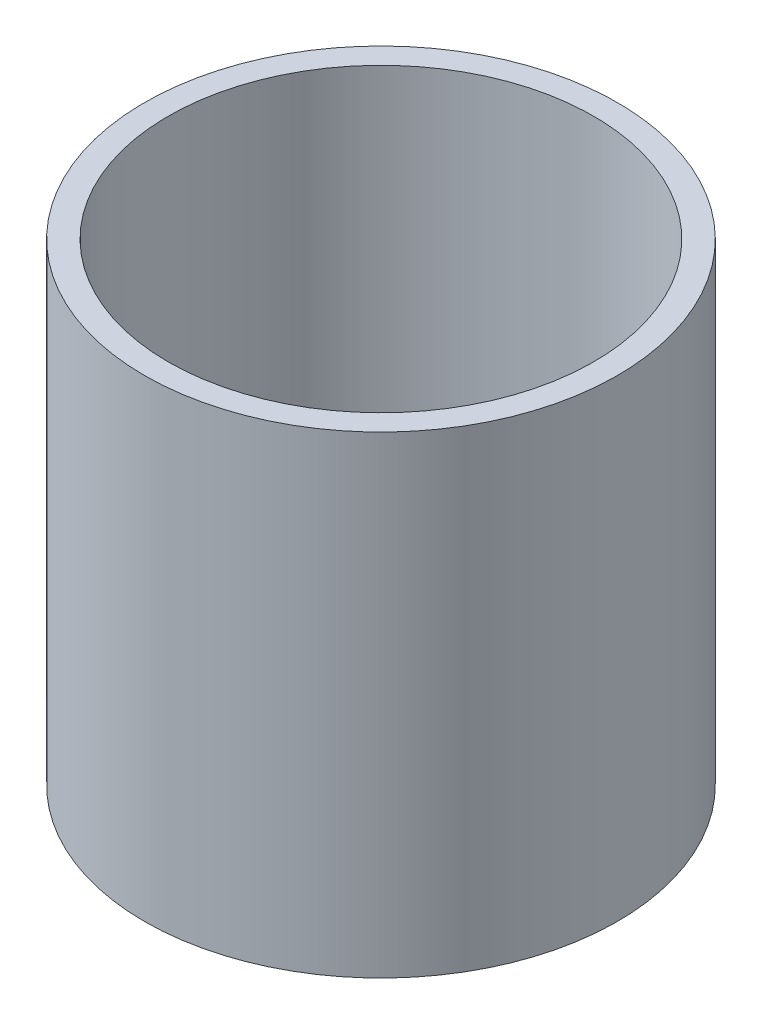
ISO-10303-21;
HEADER;
FILE_DESCRIPTION(('STEP AP214'),'2;1');
FILE_NAME('part.step','',(''),(''),'','','');
FILE_SCHEMA(('AUTOMOTIVE_DESIGN { 1 0 10303 214 1 1 1 1 }'));
ENDSEC;
DATA;
#1=APPLICATION_CONTEXT('core data for automotive mechanical design processes');
#2=APPLICATION_PROTOCOL_DEFINITION('international standard','automotive_design',2000,#1);
#3=PRODUCT_CONTEXT('',#1,'mechanical');
#4=PRODUCT('Part','Part','',(#3));
#5=PRODUCT_RELATED_PRODUCT_CATEGORY('part','',(#4));
#6=PRODUCT_DEFINITION_FORMATION('','',#4);
#7=PRODUCT_DEFINITION_CONTEXT('part definition',#1,'design');
#8=PRODUCT_DEFINITION('design','',#6,#7);
#9=PRODUCT_DEFINITION_SHAPE('','',#8);
#10=(LENGTH_UNIT() NAMED_UNIT(*) SI_UNIT(.MILLI.,.METRE.));
#11=(NAMED_UNIT(*) PLANE_ANGLE_UNIT() SI_UNIT($,.RADIAN.));
#12=(NAMED_UNIT(*) SI_UNIT($,.STERADIAN.) SOLID_ANGLE_UNIT());
#13=UNCERTAINTY_MEASURE_WITH_UNIT(LENGTH_MEASURE(1.E-05),#10,'distance_accuracy_value','');
#14=(GEOMETRIC_REPRESENTATION_CONTEXT(3) GLOBAL_UNCERTAINTY_ASSIGNED_CONTEXT((#13)) GLOBAL_UNIT_ASSIGNED_CONTEXT((#10,
#11,#12)) REPRESENTATION_CONTEXT('',''));
#15=CARTESIAN_POINT('',(0.,0.,0.));
#16=DIRECTION('',(0.,0.,1.));
#17=DIRECTION('',(1.,0.,0.));
#18=AXIS2_PLACEMENT_3D('',#15,#16,#17);
#19=CARTESIAN_POINT('',(238.313908971212,-679.905523336292,-866.486147986318));
#20=DIRECTION('',(0.,1.,0.));
#21=DIRECTION('',(0.,0.,1.));
#22=AXIS2_PLACEMENT_3D('',#19,#20,#21);
#23=CYLINDRICAL_SURFACE('',#22,13.5);
#24=CARTESIAN_POINT('',(238.313908971212,-694.905523336291,-866.486147986318));
#25=DIRECTION('',(0.,1.,0.));
#26=DIRECTION('',(0.,0.,1.));
#27=AXIS2_PLACEMENT_3D('',#24,#25,#26);
#28=CIRCLE('',#27,13.5);
#29=CARTESIAN_POINT('',(238.313908971212,-694.905523336291,-852.986147986318));
#30=VERTEX_POINT('',#29);
#31=EDGE_CURVE('E18',#30,#30,#28,.F.);
#32=ORIENTED_EDGE('',*,*,#31,.T.);
#33=EDGE_LOOP('',(#32));
#34=FACE_BOUND('',#33,.T.);
#35=CARTESIAN_POINT('',(238.313908971212,-664.905523336291,-866.486147986318));
#36=DIRECTION('',(0.,1.,0.));
#37=DIRECTION('',(0.,0.,1.));
#38=AXIS2_PLACEMENT_3D('',#35,#36,#37);
#39=CIRCLE('',#38,13.5);
#40=CARTESIAN_POINT('',(238.313908971212,-664.905523336291,-852.986147986318));
#41=VERTEX_POINT('',#40);
#42=EDGE_CURVE('E27',#41,#41,#39,.T.);
#43=ORIENTED_EDGE('',*,*,#42,.T.);
#44=EDGE_LOOP('',(#43));
#45=FACE_BOUND('',#44,.T.);
#46=ADVANCED_FACE('F15',(#34,#45),#23,.F.);
#47=CARTESIAN_POINT('',(238.313908971212,-694.905523336291,-866.486147986318));
#48=DIRECTION('',(0.,1.,0.));
#49=DIRECTION('',(0.,0.,1.));
#50=AXIS2_PLACEMENT_3D('',#47,#48,#49);
#51=PLANE('',#50);
#52=ORIENTED_EDGE('',*,*,#31,.F.);
#53=EDGE_LOOP('',(#52));
#54=FACE_BOUND('',#53,.T.);
#55=CARTESIAN_POINT('',(238.313908971212,-694.905523336291,-866.486147986318));
#56=DIRECTION('',(0.,1.,0.));
#57=DIRECTION('',(0.,0.,1.));
#58=AXIS2_PLACEMENT_3D('',#55,#56,#57);
#59=CIRCLE('',#58,15.);
#60=CARTESIAN_POINT('',(238.313908971212,-694.905523336291,-851.486147986318));
#61=VERTEX_POINT('',#60);
#62=EDGE_CURVE('E22',#61,#61,#59,.T.);
#63=ORIENTED_EDGE('',*,*,#62,.F.);
#64=EDGE_LOOP('',(#63));
#65=FACE_BOUND('',#64,.T.);
#66=ADVANCED_FACE('F36',(#54,#65),#51,.F.);
#67=CARTESIAN_POINT('',(238.313908971212,-664.905523336291,-866.486147986318));
#68=DIRECTION('',(0.,-1.,0.));
#69=DIRECTION('',(0.,0.,-1.));
#70=AXIS2_PLACEMENT_3D('',#67,#68,#69);
#71=PLANE('',#70);
#72=ORIENTED_EDGE('',*,*,#42,.F.);
#73=EDGE_LOOP('',(#72));
#74=FACE_BOUND('',#73,.T.);
#75=CARTESIAN_POINT('',(238.313908971212,-664.905523336291,-866.486147986318));
#76=DIRECTION('',(0.,1.,0.));
#77=DIRECTION('',(0.,0.,1.));
#78=AXIS2_PLACEMENT_3D('',#75,#76,#77);
#79=CIRCLE('',#78,15.);
#80=CARTESIAN_POINT('',(238.313908971212,-664.905523336291,-851.486147986318));
#81=VERTEX_POINT('',#80);
#82=EDGE_CURVE('E10',#81,#81,#79,.F.);
#83=ORIENTED_EDGE('',*,*,#82,.F.);
#84=EDGE_LOOP('',(#83));
#85=FACE_BOUND('',#84,.T.);
#86=ADVANCED_FACE('F39',(#74,#85),#71,.F.);
#87=CARTESIAN_POINT('',(238.313908971212,-679.905523336292,-866.486147986318));
#88=DIRECTION('',(0.,1.,0.));
#89=DIRECTION('',(0.,0.,1.));
#90=AXIS2_PLACEMENT_3D('',#87,#88,#89);
#91=CYLINDRICAL_SURFACE('',#90,15.);
#92=ORIENTED_EDGE('',*,*,#82,.T.);
#93=EDGE_LOOP('',(#92));
#94=FACE_BOUND('',#93,.T.);
#95=ORIENTED_EDGE('',*,*,#62,.T.);
#96=EDGE_LOOP('',(#95));
#97=FACE_BOUND('',#96,.T.);
#98=ADVANCED_FACE('F42',(#94,#97),#91,.T.);
#99=CLOSED_SHELL('',(#46,#66,#86,#98));
#100=MANIFOLD_SOLID_BREP('B1',#99);
#101=ADVANCED_BREP_SHAPE_REPRESENTATION('',(#18,#100),#14);
#102=SHAPE_DEFINITION_REPRESENTATION(#9,#101);
ENDSEC;
END-ISO-10303-21;
